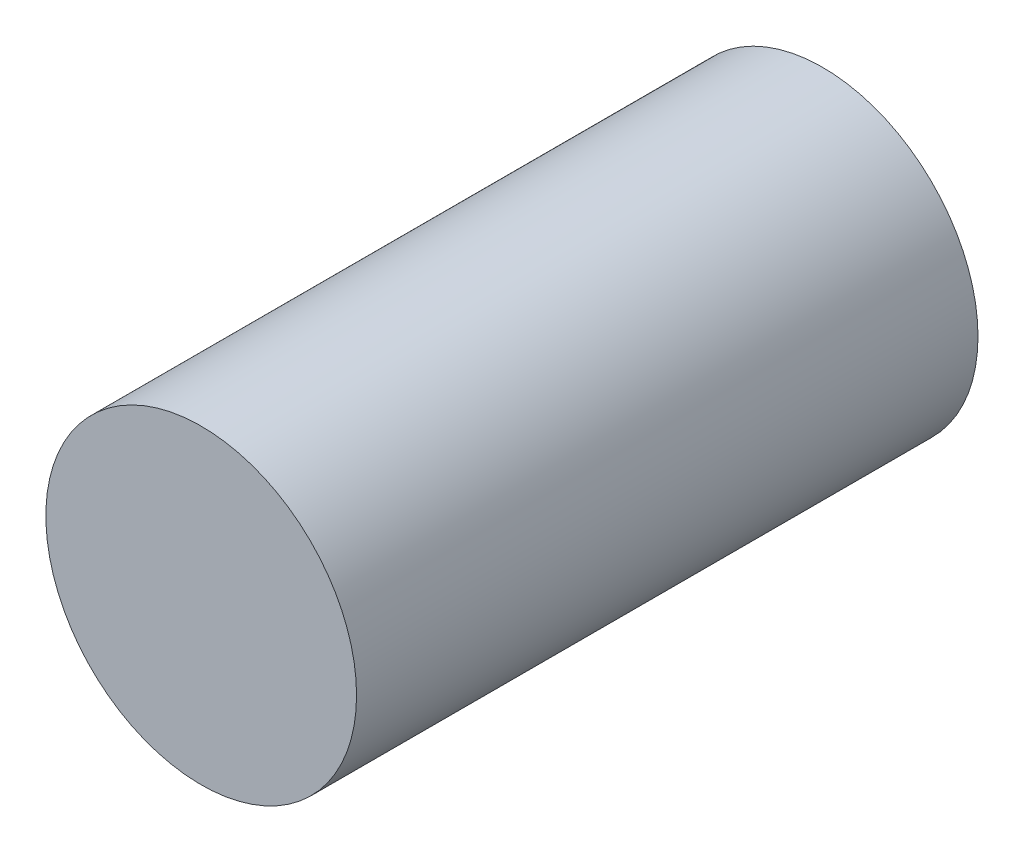
ISO-10303-21;
HEADER;
FILE_DESCRIPTION(('STEP AP214'),'2;1');
FILE_NAME('part.step','',(''),(''),'','','');
FILE_SCHEMA(('AUTOMOTIVE_DESIGN { 1 0 10303 214 1 1 1 1 }'));
ENDSEC;
DATA;
#1=APPLICATION_CONTEXT('core data for automotive mechanical design processes');
#2=APPLICATION_PROTOCOL_DEFINITION('international standard','automotive_design',2000,#1);
#3=PRODUCT_CONTEXT('',#1,'mechanical');
#4=PRODUCT('Part','Part','',(#3));
#5=PRODUCT_RELATED_PRODUCT_CATEGORY('part','',(#4));
#6=PRODUCT_DEFINITION_FORMATION('','',#4);
#7=PRODUCT_DEFINITION_CONTEXT('part definition',#1,'design');
#8=PRODUCT_DEFINITION('design','',#6,#7);
#9=PRODUCT_DEFINITION_SHAPE('','',#8);
#10=(LENGTH_UNIT() NAMED_UNIT(*) SI_UNIT(.MILLI.,.METRE.));
#11=(NAMED_UNIT(*) PLANE_ANGLE_UNIT() SI_UNIT($,.RADIAN.));
#12=(NAMED_UNIT(*) SI_UNIT($,.STERADIAN.) SOLID_ANGLE_UNIT());
#13=UNCERTAINTY_MEASURE_WITH_UNIT(LENGTH_MEASURE(1.E-05),#10,'distance_accuracy_value','');
#14=(GEOMETRIC_REPRESENTATION_CONTEXT(3) GLOBAL_UNCERTAINTY_ASSIGNED_CONTEXT((#13)) GLOBAL_UNIT_ASSIGNED_CONTEXT((#10,
#11,#12)) REPRESENTATION_CONTEXT('',''));
#15=CARTESIAN_POINT('',(0.,0.,0.));
#16=DIRECTION('',(0.,0.,1.));
#17=DIRECTION('',(1.,0.,0.));
#18=AXIS2_PLACEMENT_3D('',#15,#16,#17);
#19=CARTESIAN_POINT('',(-66.547347631499,-10.9242110990207,100.));
#20=DIRECTION('',(0.,0.,-1.));
#21=DIRECTION('',(-1.,0.,0.));
#22=AXIS2_PLACEMENT_3D('',#19,#20,#21);
#23=CYLINDRICAL_SURFACE('',#22,25.);
#24=CARTESIAN_POINT('',(-66.547347631499,-10.9242110990207,100.));
#25=DIRECTION('',(0.,0.,1.));
#26=DIRECTION('',(1.,0.,0.));
#27=AXIS2_PLACEMENT_3D('',#24,#25,#26);
#28=CIRCLE('',#27,25.);
#29=CARTESIAN_POINT('',(-41.547347631499,-10.9242110990207,100.));
#30=VERTEX_POINT('',#29);
#31=EDGE_CURVE('E10',#30,#30,#28,.T.);
#32=ORIENTED_EDGE('',*,*,#31,.F.);
#33=EDGE_LOOP('',(#32));
#34=FACE_BOUND('',#33,.T.);
#35=CARTESIAN_POINT('',(-66.547347631499,-10.9242110990207,0.));
#36=DIRECTION('',(0.,0.,1.));
#37=DIRECTION('',(1.,0.,0.));
#38=AXIS2_PLACEMENT_3D('',#35,#36,#37);
#39=CIRCLE('',#38,25.);
#40=CARTESIAN_POINT('',(-41.547347631499,-10.9242110990207,0.));
#41=VERTEX_POINT('',#40);
#42=EDGE_CURVE('E35',#41,#41,#39,.T.);
#43=ORIENTED_EDGE('',*,*,#42,.T.);
#44=EDGE_LOOP('',(#43));
#45=FACE_BOUND('',#44,.T.);
#46=ADVANCED_FACE('F32',(#34,#45),#23,.T.);
#47=CARTESIAN_POINT('',(-66.547347631499,-10.9242110990207,100.));
#48=DIRECTION('',(0.,0.,1.));
#49=DIRECTION('',(1.,0.,0.));
#50=AXIS2_PLACEMENT_3D('',#47,#48,#49);
#51=PLANE('',#50);
#52=ORIENTED_EDGE('',*,*,#31,.T.);
#53=EDGE_LOOP('',(#52));
#54=FACE_BOUND('',#53,.T.);
#55=ADVANCED_FACE('F47',(#54),#51,.T.);
#56=CARTESIAN_POINT('',(-66.547347631499,-10.9242110990207,0.));
#57=DIRECTION('',(0.,0.,1.));
#58=DIRECTION('',(1.,0.,0.));
#59=AXIS2_PLACEMENT_3D('',#56,#57,#58);
#60=PLANE('',#59);
#61=ORIENTED_EDGE('',*,*,#42,.F.);
#62=EDGE_LOOP('',(#61));
#63=FACE_BOUND('',#62,.T.);
#64=ADVANCED_FACE('F45',(#63),#60,.F.);
#65=CLOSED_SHELL('',(#46,#55,#64));
#66=MANIFOLD_SOLID_BREP('B2',#65);
#67=ADVANCED_BREP_SHAPE_REPRESENTATION('',(#18,#66),#14);
#68=SHAPE_DEFINITION_REPRESENTATION(#9,#67);
ENDSEC;
END-ISO-10303-21;
